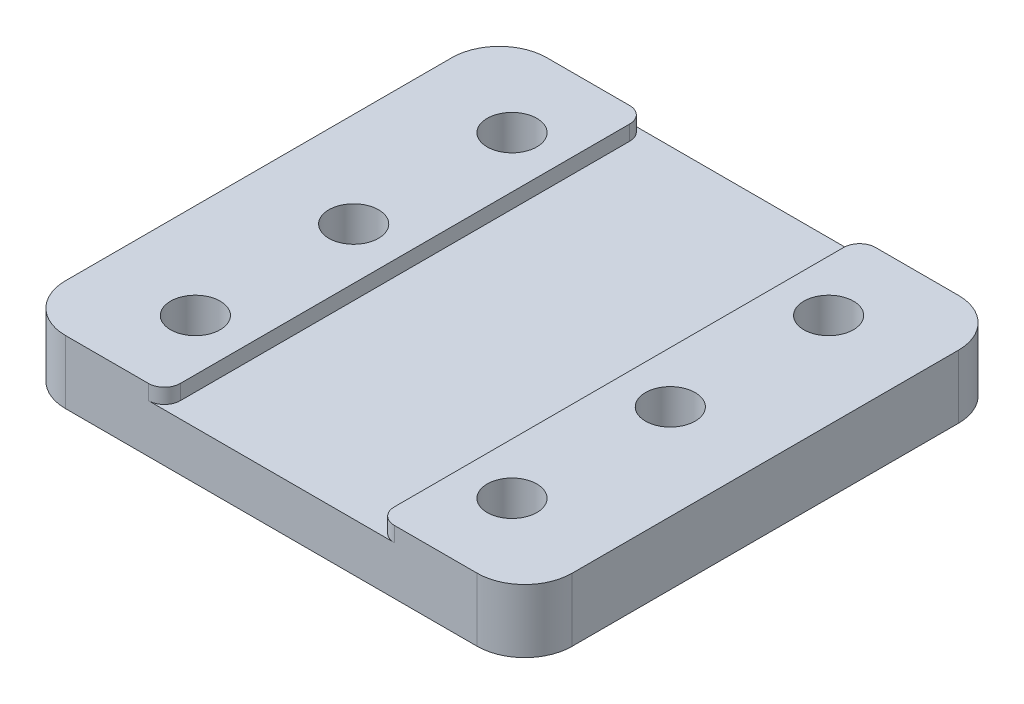
ISO-10303-21;
HEADER;
FILE_DESCRIPTION(('STEP AP214'),'2;1');
FILE_NAME('part.step','',(''),(''),'','','');
FILE_SCHEMA(('AUTOMOTIVE_DESIGN { 1 0 10303 214 1 1 1 1 }'));
ENDSEC;
DATA;
#1=APPLICATION_CONTEXT('core data for automotive mechanical design processes');
#2=APPLICATION_PROTOCOL_DEFINITION('international standard','automotive_design',2000,#1);
#3=PRODUCT_CONTEXT('',#1,'mechanical');
#4=PRODUCT('Part','Part','',(#3));
#5=PRODUCT_RELATED_PRODUCT_CATEGORY('part','',(#4));
#6=PRODUCT_DEFINITION_FORMATION('','',#4);
#7=PRODUCT_DEFINITION_CONTEXT('part definition',#1,'design');
#8=PRODUCT_DEFINITION('design','',#6,#7);
#9=PRODUCT_DEFINITION_SHAPE('','',#8);
#10=(LENGTH_UNIT() NAMED_UNIT(*) SI_UNIT(.MILLI.,.METRE.));
#11=(NAMED_UNIT(*) PLANE_ANGLE_UNIT() SI_UNIT($,.RADIAN.));
#12=(NAMED_UNIT(*) SI_UNIT($,.STERADIAN.) SOLID_ANGLE_UNIT());
#13=UNCERTAINTY_MEASURE_WITH_UNIT(LENGTH_MEASURE(1.E-05),#10,'distance_accuracy_value','');
#14=(GEOMETRIC_REPRESENTATION_CONTEXT(3) GLOBAL_UNCERTAINTY_ASSIGNED_CONTEXT((#13)) GLOBAL_UNIT_ASSIGNED_CONTEXT((#10,
#11,#12)) REPRESENTATION_CONTEXT('',''));
#15=CARTESIAN_POINT('',(0.,0.,0.));
#16=DIRECTION('',(0.,0.,1.));
#17=DIRECTION('',(1.,0.,0.));
#18=AXIS2_PLACEMENT_3D('',#15,#16,#17);
#19=CARTESIAN_POINT('',(0.,3.175,0.));
#20=DIRECTION('',(0.,1.,0.));
#21=DIRECTION('',(0.,0.,1.));
#22=AXIS2_PLACEMENT_3D('',#19,#20,#21);
#23=PLANE('',#22);
#24=DIRECTION('',(1.,0.,0.));
#25=VECTOR('',#24,1.);
#26=CARTESIAN_POINT('',(0.,3.175,0.));
#27=LINE('',#26,#25);
#28=CARTESIAN_POINT('',(4.7625,3.175,0.));
#29=VERTEX_POINT('',#28);
#30=CARTESIAN_POINT('',(13.074999885,3.175,0.));
#31=VERTEX_POINT('',#30);
#32=EDGE_CURVE('E260',#29,#31,#27,.T.);
#33=ORIENTED_EDGE('',*,*,#32,.T.);
#34=CARTESIAN_POINT('',(13.074999885,3.175,-1.600000102));
#35=DIRECTION('',(0.,1.,0.));
#36=DIRECTION('',(0.,0.,1.));
#37=AXIS2_PLACEMENT_3D('',#34,#35,#36);
#38=CIRCLE('',#37,1.600000102);
#39=CARTESIAN_POINT('',(14.674999987,3.175,-1.600000102));
#40=VERTEX_POINT('',#39);
#41=EDGE_CURVE('E237',#31,#40,#38,.T.);
#42=ORIENTED_EDGE('',*,*,#41,.T.);
#43=DIRECTION('',(0.,0.,1.));
#44=VECTOR('',#43,1.);
#45=CARTESIAN_POINT('',(14.674999987,3.175,0.));
#46=LINE('',#45,#44);
#47=CARTESIAN_POINT('',(14.674999987,3.175,-46.659999898));
#48=VERTEX_POINT('',#47);
#49=EDGE_CURVE('E313',#48,#40,#46,.T.);
#50=ORIENTED_EDGE('',*,*,#49,.F.);
#51=CARTESIAN_POINT('',(13.074999885,3.175,-46.659999898));
#52=DIRECTION('',(0.,1.,0.));
#53=DIRECTION('',(0.,0.,1.));
#54=AXIS2_PLACEMENT_3D('',#51,#52,#53);
#55=CIRCLE('',#54,1.600000102);
#56=CARTESIAN_POINT('',(13.074999885,3.175,-48.26));
#57=VERTEX_POINT('',#56);
#58=EDGE_CURVE('E235',#48,#57,#55,.T.);
#59=ORIENTED_EDGE('',*,*,#58,.T.);
#60=DIRECTION('',(1.,0.,0.));
#61=VECTOR('',#60,1.);
#62=CARTESIAN_POINT('',(0.,3.175,-48.26));
#63=LINE('',#62,#61);
#64=CARTESIAN_POINT('',(4.7625,3.175,-48.26));
#65=VERTEX_POINT('',#64);
#66=EDGE_CURVE('E183',#65,#57,#63,.T.);
#67=ORIENTED_EDGE('',*,*,#66,.F.);
#68=CARTESIAN_POINT('',(4.7625,3.175,-43.4975));
#69=DIRECTION('',(0.,1.,0.));
#70=DIRECTION('',(0.,0.,1.));
#71=AXIS2_PLACEMENT_3D('',#68,#69,#70);
#72=CIRCLE('',#71,4.7625);
#73=CARTESIAN_POINT('',(0.,3.175,-43.4975));
#74=VERTEX_POINT('',#73);
#75=EDGE_CURVE('E202',#65,#74,#72,.T.);
#76=ORIENTED_EDGE('',*,*,#75,.T.);
#77=DIRECTION('',(0.,0.,-1.));
#78=VECTOR('',#77,1.);
#79=CARTESIAN_POINT('',(0.,3.175,0.));
#80=LINE('',#79,#78);
#81=CARTESIAN_POINT('',(0.,3.175,-4.7625));
#82=VERTEX_POINT('',#81);
#83=EDGE_CURVE('E180',#82,#74,#80,.T.);
#84=ORIENTED_EDGE('',*,*,#83,.F.);
#85=CARTESIAN_POINT('',(4.7625,3.175,-4.7625));
#86=DIRECTION('',(0.,1.,0.));
#87=DIRECTION('',(0.,0.,1.));
#88=AXIS2_PLACEMENT_3D('',#85,#86,#87);
#89=CIRCLE('',#88,4.7625);
#90=EDGE_CURVE('E179',#82,#29,#89,.T.);
#91=ORIENTED_EDGE('',*,*,#90,.T.);
#92=EDGE_LOOP('',(#33,#42,#50,#59,#67,#76,#84,#91));
#93=FACE_BOUND('',#92,.T.);
#94=CARTESIAN_POINT('',(9.52500000000001,3.175,-8.255));
#95=DIRECTION('',(0.,1.,0.));
#96=DIRECTION('',(0.,0.,1.));
#97=AXIS2_PLACEMENT_3D('',#94,#95,#96);
#98=CIRCLE('',#97,2.4892);
#99=CARTESIAN_POINT('',(9.52500000000001,3.175,-5.7658));
#100=VERTEX_POINT('',#99);
#101=EDGE_CURVE('E270',#100,#100,#98,.T.);
#102=ORIENTED_EDGE('',*,*,#101,.F.);
#103=EDGE_LOOP('',(#102));
#104=FACE_BOUND('',#103,.T.);
#105=CARTESIAN_POINT('',(9.525,3.175,-24.13));
#106=DIRECTION('',(0.,1.,0.));
#107=DIRECTION('',(0.,0.,1.));
#108=AXIS2_PLACEMENT_3D('',#105,#106,#107);
#109=CIRCLE('',#108,2.4892);
#110=CARTESIAN_POINT('',(9.525,3.175,-21.6408));
#111=VERTEX_POINT('',#110);
#112=EDGE_CURVE('E331',#111,#111,#109,.T.);
#113=ORIENTED_EDGE('',*,*,#112,.F.);
#114=EDGE_LOOP('',(#113));
#115=FACE_BOUND('',#114,.T.);
#116=CARTESIAN_POINT('',(9.525,3.175,-40.005));
#117=DIRECTION('',(0.,1.,0.));
#118=DIRECTION('',(0.,0.,1.));
#119=AXIS2_PLACEMENT_3D('',#116,#117,#118);
#120=CIRCLE('',#119,2.4892);
#121=CARTESIAN_POINT('',(9.525,3.175,-37.5158));
#122=VERTEX_POINT('',#121);
#123=EDGE_CURVE('E329',#122,#122,#120,.T.);
#124=ORIENTED_EDGE('',*,*,#123,.F.);
#125=EDGE_LOOP('',(#124));
#126=FACE_BOUND('',#125,.T.);
#127=ADVANCED_FACE('F41',(#93,#104,#115,#126),#23,.T.);
#128=CARTESIAN_POINT('',(0.,3.175,0.));
#129=DIRECTION('',(0.,0.,-1.));
#130=DIRECTION('',(-1.,0.,0.));
#131=AXIS2_PLACEMENT_3D('',#128,#129,#130);
#132=PLANE('',#131);
#133=CARTESIAN_POINT('',(37.725000115,3.175,0.));
#134=VERTEX_POINT('',#133);
#135=CARTESIAN_POINT('',(46.0375,3.175,0.));
#136=VERTEX_POINT('',#135);
#137=EDGE_CURVE('E265',#134,#136,#27,.T.);
#138=ORIENTED_EDGE('',*,*,#137,.F.);
#139=DIRECTION('',(0.,1.,0.));
#140=VECTOR('',#139,1.);
#141=CARTESIAN_POINT('',(37.725000115,3.175,0.));
#142=LINE('',#141,#140);
#143=CARTESIAN_POINT('',(37.725000115,1.675000206,0.));
#144=VERTEX_POINT('',#143);
#145=EDGE_CURVE('E232',#134,#144,#142,.F.);
#146=ORIENTED_EDGE('',*,*,#145,.T.);
#147=DIRECTION('',(1.,0.,0.));
#148=VECTOR('',#147,1.);
#149=CARTESIAN_POINT('',(14.674999987,1.675000206,0.));
#150=LINE('',#149,#148);
#151=CARTESIAN_POINT('',(13.074999885,1.675000206,0.));
#152=VERTEX_POINT('',#151);
#153=EDGE_CURVE('E251',#152,#144,#150,.T.);
#154=ORIENTED_EDGE('',*,*,#153,.F.);
#155=DIRECTION('',(0.,1.,0.));
#156=VECTOR('',#155,1.);
#157=CARTESIAN_POINT('',(13.074999885,3.175,0.));
#158=LINE('',#157,#156);
#159=EDGE_CURVE('E229',#152,#31,#158,.T.);
#160=ORIENTED_EDGE('',*,*,#159,.T.);
#161=ORIENTED_EDGE('',*,*,#32,.F.);
#162=DIRECTION('',(0.,-1.,0.));
#163=VECTOR('',#162,1.);
#164=CARTESIAN_POINT('',(4.7625,-3.175,0.));
#165=LINE('',#164,#163);
#166=CARTESIAN_POINT('',(4.7625,-3.175,0.));
#167=VERTEX_POINT('',#166);
#168=EDGE_CURVE('E212',#29,#167,#165,.T.);
#169=ORIENTED_EDGE('',*,*,#168,.T.);
#170=DIRECTION('',(1.,0.,0.));
#171=VECTOR('',#170,1.);
#172=CARTESIAN_POINT('',(0.,-3.175,0.));
#173=LINE('',#172,#171);
#174=CARTESIAN_POINT('',(46.0375,-3.175,0.));
#175=VERTEX_POINT('',#174);
#176=EDGE_CURVE('E158',#167,#175,#173,.T.);
#177=ORIENTED_EDGE('',*,*,#176,.T.);
#178=DIRECTION('',(0.,-1.,0.));
#179=VECTOR('',#178,1.);
#180=CARTESIAN_POINT('',(46.0375,3.175,0.));
#181=LINE('',#180,#179);
#182=EDGE_CURVE('E209',#175,#136,#181,.F.);
#183=ORIENTED_EDGE('',*,*,#182,.T.);
#184=EDGE_LOOP('',(#138,#146,#154,#160,#161,#169,#177,#183));
#185=FACE_BOUND('',#184,.T.);
#186=ADVANCED_FACE('F259',(#185),#132,.F.);
#187=CARTESIAN_POINT('',(50.8,3.175,0.));
#188=DIRECTION('',(-1.,0.,0.));
#189=DIRECTION('',(0.,0.,1.));
#190=AXIS2_PLACEMENT_3D('',#187,#188,#189);
#191=PLANE('',#190);
#192=DIRECTION('',(0.,0.,-1.));
#193=VECTOR('',#192,1.);
#194=CARTESIAN_POINT('',(50.8,-3.175,0.));
#195=LINE('',#194,#193);
#196=CARTESIAN_POINT('',(50.8,-3.175,-4.7625));
#197=VERTEX_POINT('',#196);
#198=CARTESIAN_POINT('',(50.8,-3.175,-43.4975));
#199=VERTEX_POINT('',#198);
#200=EDGE_CURVE('E296',#197,#199,#195,.T.);
#201=ORIENTED_EDGE('',*,*,#200,.T.);
#202=DIRECTION('',(0.,-1.,0.));
#203=VECTOR('',#202,1.);
#204=CARTESIAN_POINT('',(50.8,3.175,-43.4975));
#205=LINE('',#204,#203);
#206=CARTESIAN_POINT('',(50.8,3.175,-43.4975));
#207=VERTEX_POINT('',#206);
#208=EDGE_CURVE('E207',#199,#207,#205,.F.);
#209=ORIENTED_EDGE('',*,*,#208,.T.);
#210=DIRECTION('',(0.,0.,-1.));
#211=VECTOR('',#210,1.);
#212=CARTESIAN_POINT('',(50.8,3.175,0.));
#213=LINE('',#212,#211);
#214=CARTESIAN_POINT('',(50.8,3.175,-4.7625));
#215=VERTEX_POINT('',#214);
#216=EDGE_CURVE('E264',#215,#207,#213,.T.);
#217=ORIENTED_EDGE('',*,*,#216,.F.);
#218=DIRECTION('',(0.,-1.,0.));
#219=VECTOR('',#218,1.);
#220=CARTESIAN_POINT('',(50.8,3.175,-4.7625));
#221=LINE('',#220,#219);
#222=EDGE_CURVE('E204',#215,#197,#221,.T.);
#223=ORIENTED_EDGE('',*,*,#222,.T.);
#224=EDGE_LOOP('',(#201,#209,#217,#223));
#225=FACE_BOUND('',#224,.T.);
#226=ADVANCED_FACE('F369',(#225),#191,.F.);
#227=CARTESIAN_POINT('',(0.,3.175,-48.26));
#228=DIRECTION('',(0.,0.,-1.));
#229=DIRECTION('',(-1.,0.,0.));
#230=AXIS2_PLACEMENT_3D('',#227,#228,#229);
#231=PLANE('',#230);
#232=DIRECTION('',(-1.,0.,0.));
#233=VECTOR('',#232,1.);
#234=CARTESIAN_POINT('',(14.674999987,1.675000206,-48.26));
#235=LINE('',#234,#233);
#236=CARTESIAN_POINT('',(37.725000115,1.675000206,-48.26));
#237=VERTEX_POINT('',#236);
#238=CARTESIAN_POINT('',(13.074999885,1.675000206,-48.26));
#239=VERTEX_POINT('',#238);
#240=EDGE_CURVE('E280',#237,#239,#235,.T.);
#241=ORIENTED_EDGE('',*,*,#240,.F.);
#242=DIRECTION('',(0.,1.,0.));
#243=VECTOR('',#242,1.);
#244=CARTESIAN_POINT('',(37.725000115,3.175,-48.26));
#245=LINE('',#244,#243);
#246=CARTESIAN_POINT('',(37.725000115,3.175,-48.26));
#247=VERTEX_POINT('',#246);
#248=EDGE_CURVE('E217',#237,#247,#245,.T.);
#249=ORIENTED_EDGE('',*,*,#248,.T.);
#250=CARTESIAN_POINT('',(46.0375,3.175,-48.26));
#251=VERTEX_POINT('',#250);
#252=EDGE_CURVE('E268',#247,#251,#63,.T.);
#253=ORIENTED_EDGE('',*,*,#252,.T.);
#254=DIRECTION('',(0.,-1.,0.));
#255=VECTOR('',#254,1.);
#256=CARTESIAN_POINT('',(46.0375,-3.175,-48.26));
#257=LINE('',#256,#255);
#258=CARTESIAN_POINT('',(46.0375,-3.175,-48.26));
#259=VERTEX_POINT('',#258);
#260=EDGE_CURVE('E191',#251,#259,#257,.T.);
#261=ORIENTED_EDGE('',*,*,#260,.T.);
#262=DIRECTION('',(1.,0.,0.));
#263=VECTOR('',#262,1.);
#264=CARTESIAN_POINT('',(0.,-3.175,-48.26));
#265=LINE('',#264,#263);
#266=CARTESIAN_POINT('',(4.7625,-3.175,-48.26));
#267=VERTEX_POINT('',#266);
#268=EDGE_CURVE('E175',#267,#259,#265,.T.);
#269=ORIENTED_EDGE('',*,*,#268,.F.);
#270=DIRECTION('',(0.,-1.,0.));
#271=VECTOR('',#270,1.);
#272=CARTESIAN_POINT('',(4.7625,3.175,-48.26));
#273=LINE('',#272,#271);
#274=EDGE_CURVE('E194',#267,#65,#273,.F.);
#275=ORIENTED_EDGE('',*,*,#274,.T.);
#276=ORIENTED_EDGE('',*,*,#66,.T.);
#277=DIRECTION('',(0.,1.,0.));
#278=VECTOR('',#277,1.);
#279=CARTESIAN_POINT('',(13.074999885,1.675000206,-48.26));
#280=LINE('',#279,#278);
#281=EDGE_CURVE('E214',#57,#239,#280,.F.);
#282=ORIENTED_EDGE('',*,*,#281,.T.);
#283=EDGE_LOOP('',(#241,#249,#253,#261,#269,#275,#276,#282));
#284=FACE_BOUND('',#283,.T.);
#285=ADVANCED_FACE('F303',(#284),#231,.T.);
#286=CARTESIAN_POINT('',(9.52500000000001,3.175,-8.255));
#287=DIRECTION('',(0.,-1.,0.));
#288=DIRECTION('',(0.,0.,-1.));
#289=AXIS2_PLACEMENT_3D('',#286,#287,#288);
#290=CYLINDRICAL_SURFACE('',#289,2.4892);
#291=ORIENTED_EDGE('',*,*,#101,.T.);
#292=EDGE_LOOP('',(#291));
#293=FACE_BOUND('',#292,.T.);
#294=CARTESIAN_POINT('',(9.52500000000001,-3.175,-8.255));
#295=DIRECTION('',(0.,1.,0.));
#296=DIRECTION('',(0.,0.,1.));
#297=AXIS2_PLACEMENT_3D('',#294,#295,#296);
#298=CIRCLE('',#297,2.4892);
#299=CARTESIAN_POINT('',(9.52500000000001,-3.175,-5.7658));
#300=VERTEX_POINT('',#299);
#301=EDGE_CURVE('E292',#300,#300,#298,.T.);
#302=ORIENTED_EDGE('',*,*,#301,.F.);
#303=EDGE_LOOP('',(#302));
#304=FACE_BOUND('',#303,.T.);
#305=ADVANCED_FACE('F338',(#293,#304),#290,.F.);
#306=CARTESIAN_POINT('',(9.525,3.175,-24.13));
#307=DIRECTION('',(0.,-1.,0.));
#308=DIRECTION('',(0.,0.,-1.));
#309=AXIS2_PLACEMENT_3D('',#306,#307,#308);
#310=CYLINDRICAL_SURFACE('',#309,2.4892);
#311=ORIENTED_EDGE('',*,*,#112,.T.);
#312=EDGE_LOOP('',(#311));
#313=FACE_BOUND('',#312,.T.);
#314=CARTESIAN_POINT('',(9.525,-3.175,-24.13));
#315=DIRECTION('',(0.,1.,0.));
#316=DIRECTION('',(0.,0.,1.));
#317=AXIS2_PLACEMENT_3D('',#314,#315,#316);
#318=CIRCLE('',#317,2.4892);
#319=CARTESIAN_POINT('',(9.525,-3.175,-21.6408));
#320=VERTEX_POINT('',#319);
#321=EDGE_CURVE('E289',#320,#320,#318,.T.);
#322=ORIENTED_EDGE('',*,*,#321,.F.);
#323=EDGE_LOOP('',(#322));
#324=FACE_BOUND('',#323,.T.);
#325=ADVANCED_FACE('F351',(#313,#324),#310,.F.);
#326=CARTESIAN_POINT('',(9.525,3.175,-40.005));
#327=DIRECTION('',(0.,-1.,0.));
#328=DIRECTION('',(0.,0.,-1.));
#329=AXIS2_PLACEMENT_3D('',#326,#327,#328);
#330=CYLINDRICAL_SURFACE('',#329,2.4892);
#331=ORIENTED_EDGE('',*,*,#123,.T.);
#332=EDGE_LOOP('',(#331));
#333=FACE_BOUND('',#332,.T.);
#334=CARTESIAN_POINT('',(9.525,-3.175,-40.005));
#335=DIRECTION('',(0.,1.,0.));
#336=DIRECTION('',(0.,0.,1.));
#337=AXIS2_PLACEMENT_3D('',#334,#335,#336);
#338=CIRCLE('',#337,2.4892);
#339=CARTESIAN_POINT('',(9.525,-3.175,-37.5158));
#340=VERTEX_POINT('',#339);
#341=EDGE_CURVE('E286',#340,#340,#338,.T.);
#342=ORIENTED_EDGE('',*,*,#341,.F.);
#343=EDGE_LOOP('',(#342));
#344=FACE_BOUND('',#343,.T.);
#345=ADVANCED_FACE('F347',(#333,#344),#330,.F.);
#346=CARTESIAN_POINT('',(41.275,3.175,-24.13));
#347=DIRECTION('',(0.,-1.,0.));
#348=DIRECTION('',(0.,0.,-1.));
#349=AXIS2_PLACEMENT_3D('',#346,#347,#348);
#350=CYLINDRICAL_SURFACE('',#349,2.4892);
#351=CARTESIAN_POINT('',(41.275,3.175,-24.13));
#352=DIRECTION('',(0.,1.,0.));
#353=DIRECTION('',(0.,0.,1.));
#354=AXIS2_PLACEMENT_3D('',#351,#352,#353);
#355=CIRCLE('',#354,2.4892);
#356=CARTESIAN_POINT('',(41.275,3.175,-21.6408));
#357=VERTEX_POINT('',#356);
#358=EDGE_CURVE('E326',#357,#357,#355,.T.);
#359=ORIENTED_EDGE('',*,*,#358,.T.);
#360=EDGE_LOOP('',(#359));
#361=FACE_BOUND('',#360,.T.);
#362=CARTESIAN_POINT('',(41.275,-3.175,-24.13));
#363=DIRECTION('',(0.,1.,0.));
#364=DIRECTION('',(0.,0.,1.));
#365=AXIS2_PLACEMENT_3D('',#362,#363,#364);
#366=CIRCLE('',#365,2.4892);
#367=CARTESIAN_POINT('',(41.275,-3.175,-21.6408));
#368=VERTEX_POINT('',#367);
#369=EDGE_CURVE('E283',#368,#368,#366,.T.);
#370=ORIENTED_EDGE('',*,*,#369,.F.);
#371=EDGE_LOOP('',(#370));
#372=FACE_BOUND('',#371,.T.);
#373=ADVANCED_FACE('F350',(#361,#372),#350,.F.);
#374=CARTESIAN_POINT('',(41.275,3.175,-40.005));
#375=DIRECTION('',(0.,-1.,0.));
#376=DIRECTION('',(0.,0.,-1.));
#377=AXIS2_PLACEMENT_3D('',#374,#375,#376);
#378=CYLINDRICAL_SURFACE('',#377,2.4892);
#379=CARTESIAN_POINT('',(41.275,3.175,-40.005));
#380=DIRECTION('',(0.,1.,0.));
#381=DIRECTION('',(0.,0.,1.));
#382=AXIS2_PLACEMENT_3D('',#379,#380,#381);
#383=CIRCLE('',#382,2.4892);
#384=CARTESIAN_POINT('',(41.275,3.175,-37.5158));
#385=VERTEX_POINT('',#384);
#386=EDGE_CURVE('E323',#385,#385,#383,.T.);
#387=ORIENTED_EDGE('',*,*,#386,.T.);
#388=EDGE_LOOP('',(#387));
#389=FACE_BOUND('',#388,.T.);
#390=CARTESIAN_POINT('',(41.275,-3.175,-40.005));
#391=DIRECTION('',(0.,1.,0.));
#392=DIRECTION('',(0.,0.,1.));
#393=AXIS2_PLACEMENT_3D('',#390,#391,#392);
#394=CIRCLE('',#393,2.4892);
#395=CARTESIAN_POINT('',(41.275,-3.175,-37.5158));
#396=VERTEX_POINT('',#395);
#397=EDGE_CURVE('E279',#396,#396,#394,.T.);
#398=ORIENTED_EDGE('',*,*,#397,.F.);
#399=EDGE_LOOP('',(#398));
#400=FACE_BOUND('',#399,.T.);
#401=ADVANCED_FACE('F376',(#389,#400),#378,.F.);
#402=CARTESIAN_POINT('',(41.275,3.175,-8.255));
#403=DIRECTION('',(0.,-1.,0.));
#404=DIRECTION('',(0.,0.,-1.));
#405=AXIS2_PLACEMENT_3D('',#402,#403,#404);
#406=CYLINDRICAL_SURFACE('',#405,2.4892);
#407=CARTESIAN_POINT('',(41.275,3.175,-8.255));
#408=DIRECTION('',(0.,1.,0.));
#409=DIRECTION('',(0.,0.,1.));
#410=AXIS2_PLACEMENT_3D('',#407,#408,#409);
#411=CIRCLE('',#410,2.4892);
#412=CARTESIAN_POINT('',(41.275,3.175,-5.7658));
#413=VERTEX_POINT('',#412);
#414=EDGE_CURVE('E174',#413,#413,#411,.T.);
#415=ORIENTED_EDGE('',*,*,#414,.T.);
#416=EDGE_LOOP('',(#415));
#417=FACE_BOUND('',#416,.T.);
#418=CARTESIAN_POINT('',(41.275,-3.175,-8.255));
#419=DIRECTION('',(0.,1.,0.));
#420=DIRECTION('',(0.,0.,1.));
#421=AXIS2_PLACEMENT_3D('',#418,#419,#420);
#422=CIRCLE('',#421,2.4892);
#423=CARTESIAN_POINT('',(41.275,-3.175,-5.7658));
#424=VERTEX_POINT('',#423);
#425=EDGE_CURVE('E276',#424,#424,#422,.T.);
#426=ORIENTED_EDGE('',*,*,#425,.F.);
#427=EDGE_LOOP('',(#426));
#428=FACE_BOUND('',#427,.T.);
#429=ADVANCED_FACE('F380',(#417,#428),#406,.F.);
#430=CARTESIAN_POINT('',(0.,3.175,0.));
#431=DIRECTION('',(-1.,0.,0.));
#432=DIRECTION('',(0.,0.,1.));
#433=AXIS2_PLACEMENT_3D('',#430,#431,#432);
#434=PLANE('',#433);
#435=ORIENTED_EDGE('',*,*,#83,.T.);
#436=DIRECTION('',(0.,-1.,0.));
#437=VECTOR('',#436,1.);
#438=CARTESIAN_POINT('',(0.,3.175,-43.4975));
#439=LINE('',#438,#437);
#440=CARTESIAN_POINT('',(0.,-3.175,-43.4975));
#441=VERTEX_POINT('',#440);
#442=EDGE_CURVE('E173',#74,#441,#439,.T.);
#443=ORIENTED_EDGE('',*,*,#442,.T.);
#444=DIRECTION('',(0.,0.,-1.));
#445=VECTOR('',#444,1.);
#446=CARTESIAN_POINT('',(0.,-3.175,0.));
#447=LINE('',#446,#445);
#448=CARTESIAN_POINT('',(0.,-3.175,-4.7625));
#449=VERTEX_POINT('',#448);
#450=EDGE_CURVE('E156',#449,#441,#447,.T.);
#451=ORIENTED_EDGE('',*,*,#450,.F.);
#452=DIRECTION('',(0.,-1.,0.));
#453=VECTOR('',#452,1.);
#454=CARTESIAN_POINT('',(0.,3.175,-4.7625));
#455=LINE('',#454,#453);
#456=EDGE_CURVE('E170',#449,#82,#455,.F.);
#457=ORIENTED_EDGE('',*,*,#456,.T.);
#458=EDGE_LOOP('',(#435,#443,#451,#457));
#459=FACE_BOUND('',#458,.T.);
#460=ADVANCED_FACE('F169',(#459),#434,.T.);
#461=ORIENTED_EDGE('',*,*,#252,.F.);
#462=CARTESIAN_POINT('',(37.725000115,3.175,-46.659999898));
#463=DIRECTION('',(0.,1.,0.));
#464=DIRECTION('',(0.,0.,1.));
#465=AXIS2_PLACEMENT_3D('',#462,#463,#464);
#466=CIRCLE('',#465,1.600000102);
#467=CARTESIAN_POINT('',(36.125000013,3.175,-46.659999898));
#468=VERTEX_POINT('',#467);
#469=EDGE_CURVE('E222',#247,#468,#466,.T.);
#470=ORIENTED_EDGE('',*,*,#469,.T.);
#471=DIRECTION('',(0.,0.,-1.));
#472=VECTOR('',#471,1.);
#473=CARTESIAN_POINT('',(36.125000013,3.175,0.));
#474=LINE('',#473,#472);
#475=CARTESIAN_POINT('',(36.125000013,3.175,-1.600000102));
#476=VERTEX_POINT('',#475);
#477=EDGE_CURVE('E314',#476,#468,#474,.T.);
#478=ORIENTED_EDGE('',*,*,#477,.F.);
#479=CARTESIAN_POINT('',(37.725000115,3.175,-1.600000102));
#480=DIRECTION('',(0.,1.,0.));
#481=DIRECTION('',(0.,0.,1.));
#482=AXIS2_PLACEMENT_3D('',#479,#480,#481);
#483=CIRCLE('',#482,1.600000102);
#484=EDGE_CURVE('E220',#476,#134,#483,.T.);
#485=ORIENTED_EDGE('',*,*,#484,.T.);
#486=ORIENTED_EDGE('',*,*,#137,.T.);
#487=CARTESIAN_POINT('',(46.0375,3.175,-4.7625));
#488=DIRECTION('',(0.,1.,0.));
#489=DIRECTION('',(0.,0.,1.));
#490=AXIS2_PLACEMENT_3D('',#487,#488,#489);
#491=CIRCLE('',#490,4.7625);
#492=EDGE_CURVE('E196',#136,#215,#491,.T.);
#493=ORIENTED_EDGE('',*,*,#492,.T.);
#494=ORIENTED_EDGE('',*,*,#216,.T.);
#495=CARTESIAN_POINT('',(46.0375,3.175,-43.4975));
#496=DIRECTION('',(0.,1.,0.));
#497=DIRECTION('',(0.,0.,1.));
#498=AXIS2_PLACEMENT_3D('',#495,#496,#497);
#499=CIRCLE('',#498,4.7625);
#500=EDGE_CURVE('E199',#207,#251,#499,.T.);
#501=ORIENTED_EDGE('',*,*,#500,.T.);
#502=EDGE_LOOP('',(#461,#470,#478,#485,#486,#493,#494,#501));
#503=FACE_BOUND('',#502,.T.);
#504=ORIENTED_EDGE('',*,*,#414,.F.);
#505=EDGE_LOOP('',(#504));
#506=FACE_BOUND('',#505,.T.);
#507=ORIENTED_EDGE('',*,*,#386,.F.);
#508=EDGE_LOOP('',(#507));
#509=FACE_BOUND('',#508,.T.);
#510=ORIENTED_EDGE('',*,*,#358,.F.);
#511=EDGE_LOOP('',(#510));
#512=FACE_BOUND('',#511,.T.);
#513=ADVANCED_FACE('F343',(#503,#506,#509,#512),#23,.T.);
#514=CARTESIAN_POINT('',(0.,-3.175,0.));
#515=DIRECTION('',(0.,1.,0.));
#516=DIRECTION('',(0.,0.,1.));
#517=AXIS2_PLACEMENT_3D('',#514,#515,#516);
#518=PLANE('',#517);
#519=ORIENTED_EDGE('',*,*,#425,.T.);
#520=EDGE_LOOP('',(#519));
#521=FACE_BOUND('',#520,.T.);
#522=ORIENTED_EDGE('',*,*,#397,.T.);
#523=EDGE_LOOP('',(#522));
#524=FACE_BOUND('',#523,.T.);
#525=ORIENTED_EDGE('',*,*,#369,.T.);
#526=EDGE_LOOP('',(#525));
#527=FACE_BOUND('',#526,.T.);
#528=ORIENTED_EDGE('',*,*,#341,.T.);
#529=EDGE_LOOP('',(#528));
#530=FACE_BOUND('',#529,.T.);
#531=ORIENTED_EDGE('',*,*,#321,.T.);
#532=EDGE_LOOP('',(#531));
#533=FACE_BOUND('',#532,.T.);
#534=ORIENTED_EDGE('',*,*,#301,.T.);
#535=EDGE_LOOP('',(#534));
#536=FACE_BOUND('',#535,.T.);
#537=ORIENTED_EDGE('',*,*,#450,.T.);
#538=CARTESIAN_POINT('',(4.7625,-3.175,-43.4975));
#539=DIRECTION('',(0.,1.,0.));
#540=DIRECTION('',(0.,0.,1.));
#541=AXIS2_PLACEMENT_3D('',#538,#539,#540);
#542=CIRCLE('',#541,4.7625);
#543=EDGE_CURVE('E189',#441,#267,#542,.F.);
#544=ORIENTED_EDGE('',*,*,#543,.T.);
#545=ORIENTED_EDGE('',*,*,#268,.T.);
#546=CARTESIAN_POINT('',(46.0375,-3.175,-43.4975));
#547=DIRECTION('',(0.,1.,0.));
#548=DIRECTION('',(0.,0.,1.));
#549=AXIS2_PLACEMENT_3D('',#546,#547,#548);
#550=CIRCLE('',#549,4.7625);
#551=EDGE_CURVE('E163',#259,#199,#550,.F.);
#552=ORIENTED_EDGE('',*,*,#551,.T.);
#553=ORIENTED_EDGE('',*,*,#200,.F.);
#554=CARTESIAN_POINT('',(46.0375,-3.175,-4.7625));
#555=DIRECTION('',(0.,1.,0.));
#556=DIRECTION('',(0.,0.,1.));
#557=AXIS2_PLACEMENT_3D('',#554,#555,#556);
#558=CIRCLE('',#557,4.7625);
#559=EDGE_CURVE('E164',#197,#175,#558,.F.);
#560=ORIENTED_EDGE('',*,*,#559,.T.);
#561=ORIENTED_EDGE('',*,*,#176,.F.);
#562=CARTESIAN_POINT('',(4.7625,-3.175,-4.7625));
#563=DIRECTION('',(0.,1.,0.));
#564=DIRECTION('',(0.,0.,1.));
#565=AXIS2_PLACEMENT_3D('',#562,#563,#564);
#566=CIRCLE('',#565,4.7625);
#567=EDGE_CURVE('E153',#167,#449,#566,.F.);
#568=ORIENTED_EDGE('',*,*,#567,.T.);
#569=EDGE_LOOP('',(#537,#544,#545,#552,#553,#560,#561,#568));
#570=FACE_BOUND('',#569,.T.);
#571=ADVANCED_FACE('F155',(#521,#524,#527,#530,#533,#536,#570),#518,.F.);
#572=CARTESIAN_POINT('',(4.7625,3.175,-43.4975));
#573=DIRECTION('',(0.,-1.,0.));
#574=DIRECTION('',(0.,0.,-1.));
#575=AXIS2_PLACEMENT_3D('',#572,#573,#574);
#576=CYLINDRICAL_SURFACE('',#575,4.7625);
#577=ORIENTED_EDGE('',*,*,#75,.F.);
#578=ORIENTED_EDGE('',*,*,#274,.F.);
#579=ORIENTED_EDGE('',*,*,#543,.F.);
#580=ORIENTED_EDGE('',*,*,#442,.F.);
#581=EDGE_LOOP('',(#577,#578,#579,#580));
#582=FACE_BOUND('',#581,.T.);
#583=ADVANCED_FACE('F308',(#582),#576,.T.);
#584=CARTESIAN_POINT('',(46.0375,3.175,-43.4975));
#585=DIRECTION('',(0.,1.,0.));
#586=DIRECTION('',(0.,0.,1.));
#587=AXIS2_PLACEMENT_3D('',#584,#585,#586);
#588=CYLINDRICAL_SURFACE('',#587,4.7625);
#589=ORIENTED_EDGE('',*,*,#500,.F.);
#590=ORIENTED_EDGE('',*,*,#208,.F.);
#591=ORIENTED_EDGE('',*,*,#551,.F.);
#592=ORIENTED_EDGE('',*,*,#260,.F.);
#593=EDGE_LOOP('',(#589,#590,#591,#592));
#594=FACE_BOUND('',#593,.T.);
#595=ADVANCED_FACE('F387',(#594),#588,.T.);
#596=CARTESIAN_POINT('',(4.7625,3.175,-4.7625));
#597=DIRECTION('',(0.,1.,0.));
#598=DIRECTION('',(0.,0.,1.));
#599=AXIS2_PLACEMENT_3D('',#596,#597,#598);
#600=CYLINDRICAL_SURFACE('',#599,4.7625);
#601=ORIENTED_EDGE('',*,*,#90,.F.);
#602=ORIENTED_EDGE('',*,*,#456,.F.);
#603=ORIENTED_EDGE('',*,*,#567,.F.);
#604=ORIENTED_EDGE('',*,*,#168,.F.);
#605=EDGE_LOOP('',(#601,#602,#603,#604));
#606=FACE_BOUND('',#605,.T.);
#607=ADVANCED_FACE('F178',(#606),#600,.T.);
#608=CARTESIAN_POINT('',(46.0375,3.175,-4.7625));
#609=DIRECTION('',(0.,-1.,0.));
#610=DIRECTION('',(0.,0.,-1.));
#611=AXIS2_PLACEMENT_3D('',#608,#609,#610);
#612=CYLINDRICAL_SURFACE('',#611,4.7625);
#613=ORIENTED_EDGE('',*,*,#492,.F.);
#614=ORIENTED_EDGE('',*,*,#182,.F.);
#615=ORIENTED_EDGE('',*,*,#559,.F.);
#616=ORIENTED_EDGE('',*,*,#222,.F.);
#617=EDGE_LOOP('',(#613,#614,#615,#616));
#618=FACE_BOUND('',#617,.T.);
#619=ADVANCED_FACE('F393',(#618),#612,.T.);
#620=CARTESIAN_POINT('',(14.674999987,1.675000206,0.));
#621=DIRECTION('',(-1.,0.,0.));
#622=DIRECTION('',(0.,0.,1.));
#623=AXIS2_PLACEMENT_3D('',#620,#621,#622);
#624=PLANE('',#623);
#625=ORIENTED_EDGE('',*,*,#49,.T.);
#626=DIRECTION('',(0.,1.,0.));
#627=VECTOR('',#626,1.);
#628=CARTESIAN_POINT('',(14.674999987,1.675000206,-1.600000102));
#629=LINE('',#628,#627);
#630=CARTESIAN_POINT('',(14.674999987,1.675000206,-1.600000102));
#631=VERTEX_POINT('',#630);
#632=EDGE_CURVE('E56',#40,#631,#629,.F.);
#633=ORIENTED_EDGE('',*,*,#632,.T.);
#634=DIRECTION('',(0.,0.,1.));
#635=VECTOR('',#634,1.);
#636=CARTESIAN_POINT('',(14.674999987,1.675000206,0.));
#637=LINE('',#636,#635);
#638=CARTESIAN_POINT('',(14.674999987,1.675000206,-46.659999898));
#639=VERTEX_POINT('',#638);
#640=EDGE_CURVE('E252',#639,#631,#637,.T.);
#641=ORIENTED_EDGE('',*,*,#640,.F.);
#642=DIRECTION('',(0.,1.,0.));
#643=VECTOR('',#642,1.);
#644=CARTESIAN_POINT('',(14.674999987,3.175,-46.659999898));
#645=LINE('',#644,#643);
#646=EDGE_CURVE('E239',#639,#48,#645,.T.);
#647=ORIENTED_EDGE('',*,*,#646,.T.);
#648=EDGE_LOOP('',(#625,#633,#641,#647));
#649=FACE_BOUND('',#648,.T.);
#650=ADVANCED_FACE('F312',(#649),#624,.F.);
#651=CARTESIAN_POINT('',(36.125000013,1.675000206,0.));
#652=DIRECTION('',(1.,0.,0.));
#653=DIRECTION('',(0.,0.,-1.));
#654=AXIS2_PLACEMENT_3D('',#651,#652,#653);
#655=PLANE('',#654);
#656=ORIENTED_EDGE('',*,*,#477,.T.);
#657=DIRECTION('',(0.,1.,0.));
#658=VECTOR('',#657,1.);
#659=CARTESIAN_POINT('',(36.125000013,1.675000206,-46.659999898));
#660=LINE('',#659,#658);
#661=CARTESIAN_POINT('',(36.125000013,1.675000206,-46.659999898));
#662=VERTEX_POINT('',#661);
#663=EDGE_CURVE('E227',#468,#662,#660,.F.);
#664=ORIENTED_EDGE('',*,*,#663,.T.);
#665=DIRECTION('',(0.,0.,-1.));
#666=VECTOR('',#665,1.);
#667=CARTESIAN_POINT('',(36.125000013,1.675000206,0.));
#668=LINE('',#667,#666);
#669=CARTESIAN_POINT('',(36.125000013,1.675000206,-1.600000102));
#670=VERTEX_POINT('',#669);
#671=EDGE_CURVE('E615',#670,#662,#668,.T.);
#672=ORIENTED_EDGE('',*,*,#671,.F.);
#673=DIRECTION('',(0.,1.,0.));
#674=VECTOR('',#673,1.);
#675=CARTESIAN_POINT('',(36.125000013,1.675000206,-1.600000102));
#676=LINE('',#675,#674);
#677=EDGE_CURVE('E224',#670,#476,#676,.T.);
#678=ORIENTED_EDGE('',*,*,#677,.T.);
#679=EDGE_LOOP('',(#656,#664,#672,#678));
#680=FACE_BOUND('',#679,.T.);
#681=ADVANCED_FACE('F439',(#680),#655,.F.);
#682=CARTESIAN_POINT('',(0.,1.675000206,0.));
#683=DIRECTION('',(0.,-1.,0.));
#684=DIRECTION('',(0.,0.,-1.));
#685=AXIS2_PLACEMENT_3D('',#682,#683,#684);
#686=PLANE('',#685);
#687=ORIENTED_EDGE('',*,*,#240,.T.);
#688=CARTESIAN_POINT('',(13.074999885,1.675000206,-46.659999898));
#689=DIRECTION('',(0.,-1.,0.));
#690=DIRECTION('',(0.,0.,-1.));
#691=AXIS2_PLACEMENT_3D('',#688,#689,#690);
#692=CIRCLE('',#691,1.600000102);
#693=EDGE_CURVE('E11',#239,#639,#692,.T.);
#694=ORIENTED_EDGE('',*,*,#693,.T.);
#695=ORIENTED_EDGE('',*,*,#640,.T.);
#696=CARTESIAN_POINT('',(13.074999885,1.675000206,-1.600000102));
#697=DIRECTION('',(0.,-1.,0.));
#698=DIRECTION('',(0.,0.,-1.));
#699=AXIS2_PLACEMENT_3D('',#696,#697,#698);
#700=CIRCLE('',#699,1.600000102);
#701=EDGE_CURVE('E49',#631,#152,#700,.T.);
#702=ORIENTED_EDGE('',*,*,#701,.T.);
#703=ORIENTED_EDGE('',*,*,#153,.T.);
#704=CARTESIAN_POINT('',(37.725000115,1.675000206,-1.600000102));
#705=DIRECTION('',(0.,-1.,0.));
#706=DIRECTION('',(0.,0.,-1.));
#707=AXIS2_PLACEMENT_3D('',#704,#705,#706);
#708=CIRCLE('',#707,1.600000102);
#709=EDGE_CURVE('E246',#144,#670,#708,.T.);
#710=ORIENTED_EDGE('',*,*,#709,.T.);
#711=ORIENTED_EDGE('',*,*,#671,.T.);
#712=CARTESIAN_POINT('',(37.725000115,1.675000206,-46.659999898));
#713=DIRECTION('',(0.,-1.,0.));
#714=DIRECTION('',(0.,0.,-1.));
#715=AXIS2_PLACEMENT_3D('',#712,#713,#714);
#716=CIRCLE('',#715,1.600000102);
#717=EDGE_CURVE('E243',#662,#237,#716,.T.);
#718=ORIENTED_EDGE('',*,*,#717,.T.);
#719=EDGE_LOOP('',(#687,#694,#695,#702,#703,#710,#711,#718));
#720=FACE_BOUND('',#719,.T.);
#721=ADVANCED_FACE('F250',(#720),#686,.F.);
#722=CARTESIAN_POINT('',(37.725000115,3.175,-46.659999898));
#723=DIRECTION('',(0.,-1.,0.));
#724=DIRECTION('',(0.,0.,-1.));
#725=AXIS2_PLACEMENT_3D('',#722,#723,#724);
#726=CYLINDRICAL_SURFACE('',#725,1.600000102);
#727=ORIENTED_EDGE('',*,*,#717,.F.);
#728=ORIENTED_EDGE('',*,*,#663,.F.);
#729=ORIENTED_EDGE('',*,*,#469,.F.);
#730=ORIENTED_EDGE('',*,*,#248,.F.);
#731=EDGE_LOOP('',(#727,#728,#729,#730));
#732=FACE_BOUND('',#731,.T.);
#733=ADVANCED_FACE('F397',(#732),#726,.T.);
#734=CARTESIAN_POINT('',(37.725000115,1.675000206,-1.600000102));
#735=DIRECTION('',(0.,1.,0.));
#736=DIRECTION('',(0.,0.,1.));
#737=AXIS2_PLACEMENT_3D('',#734,#735,#736);
#738=CYLINDRICAL_SURFACE('',#737,1.600000102);
#739=ORIENTED_EDGE('',*,*,#709,.F.);
#740=ORIENTED_EDGE('',*,*,#145,.F.);
#741=ORIENTED_EDGE('',*,*,#484,.F.);
#742=ORIENTED_EDGE('',*,*,#677,.F.);
#743=EDGE_LOOP('',(#739,#740,#741,#742));
#744=FACE_BOUND('',#743,.T.);
#745=ADVANCED_FACE('F400',(#744),#738,.T.);
#746=CARTESIAN_POINT('',(13.074999885,3.175,-1.600000102));
#747=DIRECTION('',(0.,1.,0.));
#748=DIRECTION('',(0.,0.,1.));
#749=AXIS2_PLACEMENT_3D('',#746,#747,#748);
#750=CYLINDRICAL_SURFACE('',#749,1.600000102);
#751=ORIENTED_EDGE('',*,*,#701,.F.);
#752=ORIENTED_EDGE('',*,*,#632,.F.);
#753=ORIENTED_EDGE('',*,*,#41,.F.);
#754=ORIENTED_EDGE('',*,*,#159,.F.);
#755=EDGE_LOOP('',(#751,#752,#753,#754));
#756=FACE_BOUND('',#755,.T.);
#757=ADVANCED_FACE('F254',(#756),#750,.T.);
#758=CARTESIAN_POINT('',(13.074999885,1.675000206,-46.659999898));
#759=DIRECTION('',(0.,-1.,0.));
#760=DIRECTION('',(0.,0.,-1.));
#761=AXIS2_PLACEMENT_3D('',#758,#759,#760);
#762=CYLINDRICAL_SURFACE('',#761,1.600000102);
#763=ORIENTED_EDGE('',*,*,#693,.F.);
#764=ORIENTED_EDGE('',*,*,#281,.F.);
#765=ORIENTED_EDGE('',*,*,#58,.F.);
#766=ORIENTED_EDGE('',*,*,#646,.F.);
#767=EDGE_LOOP('',(#763,#764,#765,#766));
#768=FACE_BOUND('',#767,.T.);
#769=ADVANCED_FACE('F43',(#768),#762,.T.);
#770=CLOSED_SHELL('',(#127,#186,#226,#285,#305,#325,#345,#373,#401,#429,#460,#513,#571,#583,
#595,#607,#619,#650,#681,#721,#733,#745,#757,#769));
#771=MANIFOLD_SOLID_BREP('B2',#770);
#772=ADVANCED_BREP_SHAPE_REPRESENTATION('',(#18,#771),#14);
#773=SHAPE_DEFINITION_REPRESENTATION(#9,#772);
ENDSEC;
END-ISO-10303-21;
